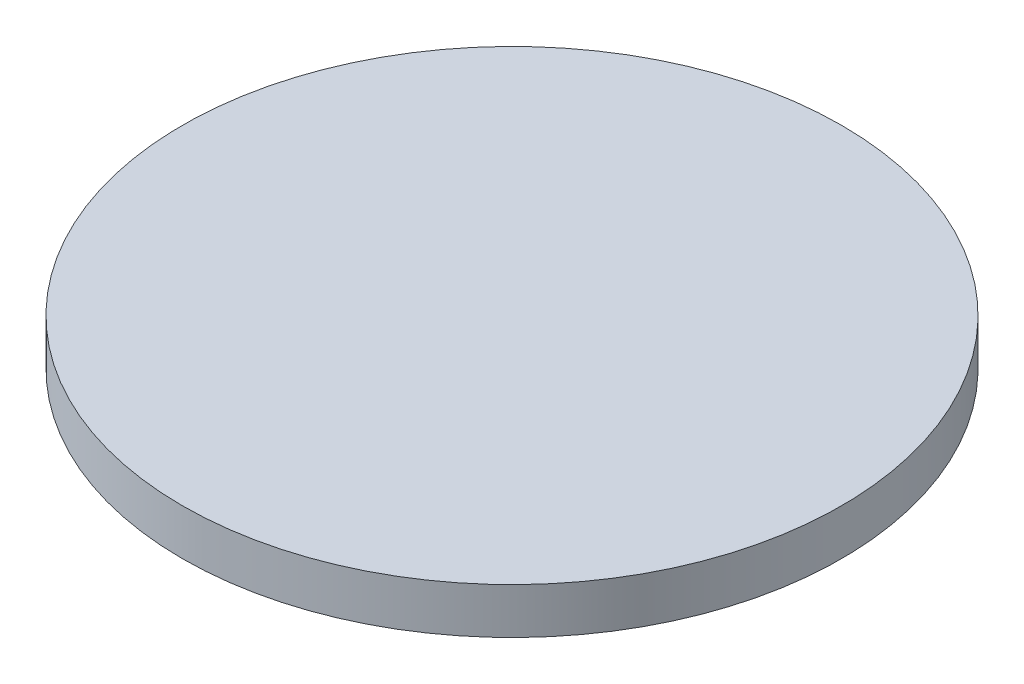
ISO-10303-21;
HEADER;
FILE_DESCRIPTION(('STEP AP214'),'2;1');
FILE_NAME('part.step','',(''),(''),'','','');
FILE_SCHEMA(('AUTOMOTIVE_DESIGN { 1 0 10303 214 1 1 1 1 }'));
ENDSEC;
DATA;
#1=APPLICATION_CONTEXT('core data for automotive mechanical design processes');
#2=APPLICATION_PROTOCOL_DEFINITION('international standard','automotive_design',2000,#1);
#3=PRODUCT_CONTEXT('',#1,'mechanical');
#4=PRODUCT('Part','Part','',(#3));
#5=PRODUCT_RELATED_PRODUCT_CATEGORY('part','',(#4));
#6=PRODUCT_DEFINITION_FORMATION('','',#4);
#7=PRODUCT_DEFINITION_CONTEXT('part definition',#1,'design');
#8=PRODUCT_DEFINITION('design','',#6,#7);
#9=PRODUCT_DEFINITION_SHAPE('','',#8);
#10=(LENGTH_UNIT() NAMED_UNIT(*) SI_UNIT(.MILLI.,.METRE.));
#11=(NAMED_UNIT(*) PLANE_ANGLE_UNIT() SI_UNIT($,.RADIAN.));
#12=(NAMED_UNIT(*) SI_UNIT($,.STERADIAN.) SOLID_ANGLE_UNIT());
#13=UNCERTAINTY_MEASURE_WITH_UNIT(LENGTH_MEASURE(1.E-05),#10,'distance_accuracy_value','');
#14=(GEOMETRIC_REPRESENTATION_CONTEXT(3) GLOBAL_UNCERTAINTY_ASSIGNED_CONTEXT((#13)) GLOBAL_UNIT_ASSIGNED_CONTEXT((#10,
#11,#12)) REPRESENTATION_CONTEXT('',''));
#15=CARTESIAN_POINT('',(0.,0.,0.));
#16=DIRECTION('',(0.,0.,1.));
#17=DIRECTION('',(1.,0.,0.));
#18=AXIS2_PLACEMENT_3D('',#15,#16,#17);
#19=CARTESIAN_POINT('',(0.,1.6,0.));
#20=DIRECTION('',(0.,-1.,0.));
#21=DIRECTION('',(0.,0.,-1.));
#22=AXIS2_PLACEMENT_3D('',#19,#20,#21);
#23=CYLINDRICAL_SURFACE('',#22,11.5);
#24=CARTESIAN_POINT('',(0.,1.6,0.));
#25=DIRECTION('',(0.,1.,0.));
#26=DIRECTION('',(0.,0.,1.));
#27=AXIS2_PLACEMENT_3D('',#24,#25,#26);
#28=CIRCLE('',#27,11.5);
#29=CARTESIAN_POINT('',(0.,1.6,11.5));
#30=VERTEX_POINT('',#29);
#31=EDGE_CURVE('E10',#30,#30,#28,.T.);
#32=ORIENTED_EDGE('',*,*,#31,.F.);
#33=EDGE_LOOP('',(#32));
#34=FACE_BOUND('',#33,.T.);
#35=CARTESIAN_POINT('',(0.,0.,0.));
#36=DIRECTION('',(0.,1.,0.));
#37=DIRECTION('',(0.,0.,1.));
#38=AXIS2_PLACEMENT_3D('',#35,#36,#37);
#39=CIRCLE('',#38,11.5);
#40=CARTESIAN_POINT('',(0.,0.,11.5));
#41=VERTEX_POINT('',#40);
#42=EDGE_CURVE('E40',#41,#41,#39,.T.);
#43=ORIENTED_EDGE('',*,*,#42,.T.);
#44=EDGE_LOOP('',(#43));
#45=FACE_BOUND('',#44,.T.);
#46=ADVANCED_FACE('F37',(#34,#45),#23,.T.);
#47=CARTESIAN_POINT('',(0.,1.6,0.));
#48=DIRECTION('',(0.,1.,0.));
#49=DIRECTION('',(0.,0.,1.));
#50=AXIS2_PLACEMENT_3D('',#47,#48,#49);
#51=PLANE('',#50);
#52=ORIENTED_EDGE('',*,*,#31,.T.);
#53=EDGE_LOOP('',(#52));
#54=FACE_BOUND('',#53,.T.);
#55=ADVANCED_FACE('F52',(#54),#51,.T.);
#56=CARTESIAN_POINT('',(0.,0.,0.));
#57=DIRECTION('',(0.,1.,0.));
#58=DIRECTION('',(0.,0.,1.));
#59=AXIS2_PLACEMENT_3D('',#56,#57,#58);
#60=PLANE('',#59);
#61=ORIENTED_EDGE('',*,*,#42,.F.);
#62=EDGE_LOOP('',(#61));
#63=FACE_BOUND('',#62,.T.);
#64=ADVANCED_FACE('F50',(#63),#60,.F.);
#65=CLOSED_SHELL('',(#46,#55,#64));
#66=MANIFOLD_SOLID_BREP('B2',#65);
#67=ADVANCED_BREP_SHAPE_REPRESENTATION('',(#18,#66),#14);
#68=SHAPE_DEFINITION_REPRESENTATION(#9,#67);
ENDSEC;
END-ISO-10303-21;
